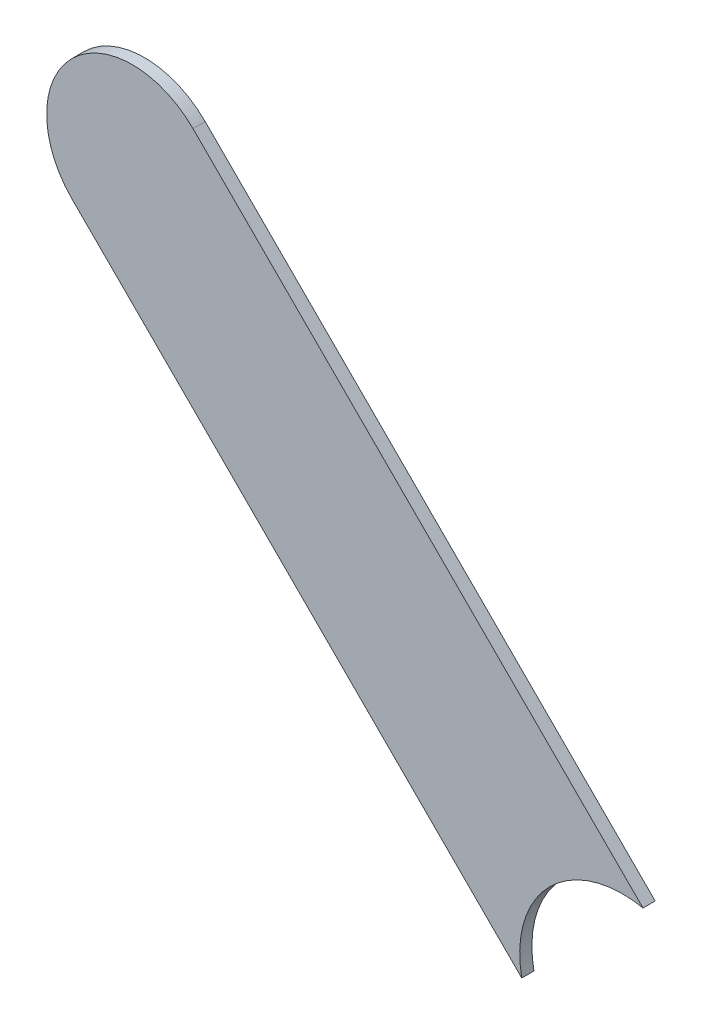
ISO-10303-21;
HEADER;
FILE_DESCRIPTION(('STEP AP214'),'2;1');
FILE_NAME('part.step','',(''),(''),'','','');
FILE_SCHEMA(('AUTOMOTIVE_DESIGN { 1 0 10303 214 1 1 1 1 }'));
ENDSEC;
DATA;
#1=APPLICATION_CONTEXT('core data for automotive mechanical design processes');
#2=APPLICATION_PROTOCOL_DEFINITION('international standard','automotive_design',2000,#1);
#3=PRODUCT_CONTEXT('',#1,'mechanical');
#4=PRODUCT('Part','Part','',(#3));
#5=PRODUCT_RELATED_PRODUCT_CATEGORY('part','',(#4));
#6=PRODUCT_DEFINITION_FORMATION('','',#4);
#7=PRODUCT_DEFINITION_CONTEXT('part definition',#1,'design');
#8=PRODUCT_DEFINITION('design','',#6,#7);
#9=PRODUCT_DEFINITION_SHAPE('','',#8);
#10=(LENGTH_UNIT() NAMED_UNIT(*) SI_UNIT(.MILLI.,.METRE.));
#11=(NAMED_UNIT(*) PLANE_ANGLE_UNIT() SI_UNIT($,.RADIAN.));
#12=(NAMED_UNIT(*) SI_UNIT($,.STERADIAN.) SOLID_ANGLE_UNIT());
#13=UNCERTAINTY_MEASURE_WITH_UNIT(LENGTH_MEASURE(1.E-05),#10,'distance_accuracy_value','');
#14=(GEOMETRIC_REPRESENTATION_CONTEXT(3) GLOBAL_UNCERTAINTY_ASSIGNED_CONTEXT((#13)) GLOBAL_UNIT_ASSIGNED_CONTEXT((#10,
#11,#12)) REPRESENTATION_CONTEXT('',''));
#15=CARTESIAN_POINT('',(0.,0.,0.));
#16=DIRECTION('',(0.,0.,1.));
#17=DIRECTION('',(1.,0.,0.));
#18=AXIS2_PLACEMENT_3D('',#15,#16,#17);
#19=CARTESIAN_POINT('',(92.79362442,84.25282362,0.));
#20=DIRECTION('',(0.707106781186544,0.707106781186551,0.));
#21=DIRECTION('',(0.707106781186551,-0.707106781186544,0.));
#22=AXIS2_PLACEMENT_3D('',#19,#20,#21);
#23=PLANE('',#22);
#24=DIRECTION('',(0.707106781186551,-0.707106781186544,0.));
#25=VECTOR('',#24,1.);
#26=CARTESIAN_POINT('',(92.79362442,84.25282362,0.03556));
#27=LINE('',#26,#25);
#28=CARTESIAN_POINT('',(92.79362442,84.25282362,0.03556));
#29=VERTEX_POINT('',#28);
#30=CARTESIAN_POINT('',(94.1059779181995,82.9404701218005,0.03556));
#31=VERTEX_POINT('',#30);
#32=EDGE_CURVE('E11',#29,#31,#27,.T.);
#33=ORIENTED_EDGE('',*,*,#32,.F.);
#34=DIRECTION('',(0.,0.,1.));
#35=VECTOR('',#34,1.);
#36=CARTESIAN_POINT('',(92.79362442,84.25282362,0.));
#37=LINE('',#36,#35);
#38=CARTESIAN_POINT('',(92.79362442,84.25282362,0.));
#39=VERTEX_POINT('',#38);
#40=EDGE_CURVE('E24',#39,#29,#37,.T.);
#41=ORIENTED_EDGE('',*,*,#40,.F.);
#42=DIRECTION('',(0.707106781186551,-0.707106781186544,0.));
#43=VECTOR('',#42,1.);
#44=CARTESIAN_POINT('',(92.79362442,84.25282362,0.));
#45=LINE('',#44,#43);
#46=CARTESIAN_POINT('',(94.1059779181995,82.9404701218005,0.));
#47=VERTEX_POINT('',#46);
#48=EDGE_CURVE('E75',#39,#47,#45,.T.);
#49=ORIENTED_EDGE('',*,*,#48,.T.);
#50=DIRECTION('',(0.,0.,1.));
#51=VECTOR('',#50,1.);
#52=CARTESIAN_POINT('',(94.1059779181995,82.9404701218005,0.));
#53=LINE('',#52,#51);
#54=EDGE_CURVE('E37',#47,#31,#53,.T.);
#55=ORIENTED_EDGE('',*,*,#54,.T.);
#56=EDGE_LOOP('',(#33,#41,#49,#55));
#57=FACE_BOUND('',#56,.T.);
#58=ADVANCED_FACE('F17',(#57),#23,.F.);
#59=CARTESIAN_POINT('',(94.4000144,82.9999864,0.));
#60=DIRECTION('',(0.,0.,-1.));
#61=DIRECTION('',(1.,0.,0.));
#62=AXIS2_PLACEMENT_3D('',#59,#60,#61);
#63=CYLINDRICAL_SURFACE('',#62,0.2999994);
#64=DIRECTION('',(0.,0.,1.));
#65=VECTOR('',#64,1.);
#66=CARTESIAN_POINT('',(94.4595306781995,83.2940228818006,0.));
#67=LINE('',#66,#65);
#68=CARTESIAN_POINT('',(94.4595306781995,83.2940228818006,0.));
#69=VERTEX_POINT('',#68);
#70=CARTESIAN_POINT('',(94.4595306781995,83.2940228818006,0.03556));
#71=VERTEX_POINT('',#70);
#72=EDGE_CURVE('E67',#69,#71,#67,.T.);
#73=ORIENTED_EDGE('',*,*,#72,.T.);
#74=CARTESIAN_POINT('',(94.4000144,82.9999864,0.03556));
#75=DIRECTION('',(0.,0.,1.));
#76=DIRECTION('',(1.,0.,0.));
#77=AXIS2_PLACEMENT_3D('',#74,#75,#76);
#78=CIRCLE('',#77,0.2999994);
#79=EDGE_CURVE('E82',#71,#31,#78,.T.);
#80=ORIENTED_EDGE('',*,*,#79,.T.);
#81=ORIENTED_EDGE('',*,*,#54,.F.);
#82=CARTESIAN_POINT('',(94.4000144,82.9999864,0.));
#83=DIRECTION('',(0.,0.,1.));
#84=DIRECTION('',(1.,0.,0.));
#85=AXIS2_PLACEMENT_3D('',#82,#83,#84);
#86=CIRCLE('',#85,0.2999994);
#87=EDGE_CURVE('E80',#69,#47,#86,.T.);
#88=ORIENTED_EDGE('',*,*,#87,.F.);
#89=EDGE_LOOP('',(#73,#80,#81,#88));
#90=FACE_BOUND('',#89,.T.);
#91=ADVANCED_FACE('F88',(#90),#63,.F.);
#92=CARTESIAN_POINT('',(94.4595306781995,83.2940228818006,0.));
#93=DIRECTION('',(-0.707106781186548,-0.707106781186548,0.));
#94=DIRECTION('',(-0.707106781186548,0.707106781186548,0.));
#95=AXIS2_PLACEMENT_3D('',#92,#93,#94);
#96=PLANE('',#95);
#97=DIRECTION('',(-0.707106781186548,0.707106781186548,0.));
#98=VECTOR('',#97,1.);
#99=CARTESIAN_POINT('',(94.57679078,83.17676278,0.03556));
#100=LINE('',#99,#98);
#101=CARTESIAN_POINT('',(93.14717718,84.60637638,0.03556));
#102=VERTEX_POINT('',#101);
#103=EDGE_CURVE('E71',#71,#102,#100,.T.);
#104=ORIENTED_EDGE('',*,*,#103,.F.);
#105=ORIENTED_EDGE('',*,*,#72,.F.);
#106=DIRECTION('',(-0.707106781186548,0.707106781186548,0.));
#107=VECTOR('',#106,1.);
#108=CARTESIAN_POINT('',(94.57679078,83.17676278,0.));
#109=LINE('',#108,#107);
#110=CARTESIAN_POINT('',(93.14717718,84.60637638,0.));
#111=VERTEX_POINT('',#110);
#112=EDGE_CURVE('E63',#69,#111,#109,.T.);
#113=ORIENTED_EDGE('',*,*,#112,.T.);
#114=DIRECTION('',(0.,0.,1.));
#115=VECTOR('',#114,1.);
#116=CARTESIAN_POINT('',(93.14717718,84.60637638,0.));
#117=LINE('',#116,#115);
#118=EDGE_CURVE('E53',#111,#102,#117,.T.);
#119=ORIENTED_EDGE('',*,*,#118,.T.);
#120=EDGE_LOOP('',(#104,#105,#113,#119));
#121=FACE_BOUND('',#120,.T.);
#122=ADVANCED_FACE('F66',(#121),#96,.F.);
#123=CARTESIAN_POINT('',(92.9704008,84.4296,0.));
#124=DIRECTION('',(0.,0.,-1.));
#125=DIRECTION('',(0.707106781186548,0.707106781186548,0.));
#126=AXIS2_PLACEMENT_3D('',#123,#124,#125);
#127=CYLINDRICAL_SURFACE('',#126,0.249999554103223);
#128=CARTESIAN_POINT('',(92.9704008,84.4296,0.03556));
#129=DIRECTION('',(0.,0.,1.));
#130=DIRECTION('',(0.707106781186548,0.707106781186548,0.));
#131=AXIS2_PLACEMENT_3D('',#128,#129,#130);
#132=CIRCLE('',#131,0.249999554103223);
#133=EDGE_CURVE('E59',#102,#29,#132,.T.);
#134=ORIENTED_EDGE('',*,*,#133,.F.);
#135=ORIENTED_EDGE('',*,*,#118,.F.);
#136=CARTESIAN_POINT('',(92.9704008,84.4296,0.));
#137=DIRECTION('',(0.,0.,1.));
#138=DIRECTION('',(0.707106781186548,0.707106781186548,0.));
#139=AXIS2_PLACEMENT_3D('',#136,#137,#138);
#140=CIRCLE('',#139,0.249999554103223);
#141=EDGE_CURVE('E57',#111,#39,#140,.T.);
#142=ORIENTED_EDGE('',*,*,#141,.T.);
#143=ORIENTED_EDGE('',*,*,#40,.T.);
#144=EDGE_LOOP('',(#134,#135,#142,#143));
#145=FACE_BOUND('',#144,.T.);
#146=ADVANCED_FACE('F55',(#145),#127,.T.);
#147=CARTESIAN_POINT('',(92.79362442,84.25282362,0.));
#148=DIRECTION('',(0.,0.,-1.));
#149=DIRECTION('',(-1.,0.,0.));
#150=AXIS2_PLACEMENT_3D('',#147,#148,#149);
#151=PLANE('',#150);
#152=ORIENTED_EDGE('',*,*,#48,.F.);
#153=ORIENTED_EDGE('',*,*,#141,.F.);
#154=ORIENTED_EDGE('',*,*,#112,.F.);
#155=ORIENTED_EDGE('',*,*,#87,.T.);
#156=EDGE_LOOP('',(#152,#153,#154,#155));
#157=FACE_BOUND('',#156,.T.);
#158=ADVANCED_FACE('F74',(#157),#151,.T.);
#159=CARTESIAN_POINT('',(92.79362442,84.25282362,0.03556));
#160=DIRECTION('',(0.,0.,-1.));
#161=DIRECTION('',(-1.,0.,0.));
#162=AXIS2_PLACEMENT_3D('',#159,#160,#161);
#163=PLANE('',#162);
#164=ORIENTED_EDGE('',*,*,#133,.T.);
#165=ORIENTED_EDGE('',*,*,#32,.T.);
#166=ORIENTED_EDGE('',*,*,#79,.F.);
#167=ORIENTED_EDGE('',*,*,#103,.T.);
#168=EDGE_LOOP('',(#164,#165,#166,#167));
#169=FACE_BOUND('',#168,.T.);
#170=ADVANCED_FACE('F91',(#169),#163,.F.);
#171=CLOSED_SHELL('',(#58,#91,#122,#146,#158,#170));
#172=MANIFOLD_SOLID_BREP('B1',#171);
#173=ADVANCED_BREP_SHAPE_REPRESENTATION('',(#18,#172),#14);
#174=SHAPE_DEFINITION_REPRESENTATION(#9,#173);
ENDSEC;
END-ISO-10303-21;
